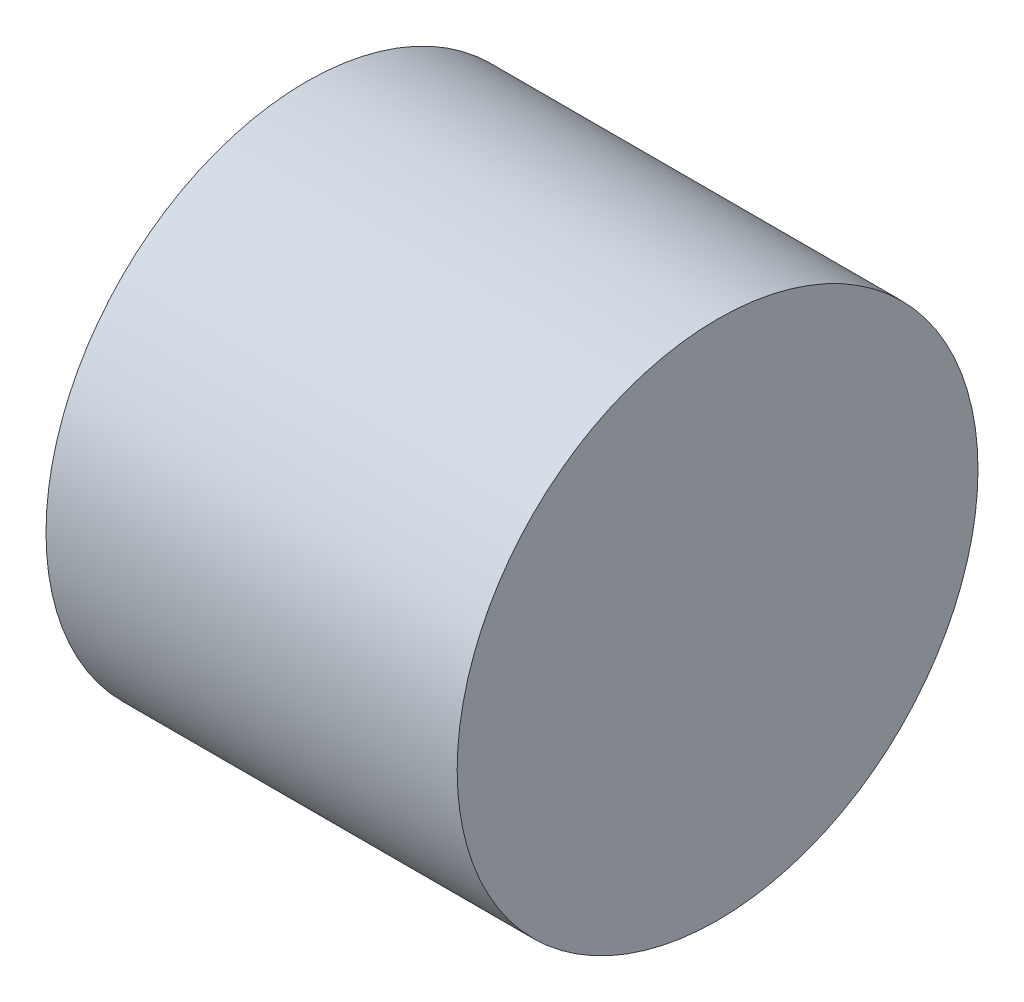
ISO-10303-21;
HEADER;
FILE_DESCRIPTION(('STEP AP214'),'2;1');
FILE_NAME('part.step','',(''),(''),'','','');
FILE_SCHEMA(('AUTOMOTIVE_DESIGN { 1 0 10303 214 1 1 1 1 }'));
ENDSEC;
DATA;
#1=APPLICATION_CONTEXT('core data for automotive mechanical design processes');
#2=APPLICATION_PROTOCOL_DEFINITION('international standard','automotive_design',2000,#1);
#3=PRODUCT_CONTEXT('',#1,'mechanical');
#4=PRODUCT('Part','Part','',(#3));
#5=PRODUCT_RELATED_PRODUCT_CATEGORY('part','',(#4));
#6=PRODUCT_DEFINITION_FORMATION('','',#4);
#7=PRODUCT_DEFINITION_CONTEXT('part definition',#1,'design');
#8=PRODUCT_DEFINITION('design','',#6,#7);
#9=PRODUCT_DEFINITION_SHAPE('','',#8);
#10=(LENGTH_UNIT() NAMED_UNIT(*) SI_UNIT(.MILLI.,.METRE.));
#11=(NAMED_UNIT(*) PLANE_ANGLE_UNIT() SI_UNIT($,.RADIAN.));
#12=(NAMED_UNIT(*) SI_UNIT($,.STERADIAN.) SOLID_ANGLE_UNIT());
#13=UNCERTAINTY_MEASURE_WITH_UNIT(LENGTH_MEASURE(1.E-05),#10,'distance_accuracy_value','');
#14=(GEOMETRIC_REPRESENTATION_CONTEXT(3) GLOBAL_UNCERTAINTY_ASSIGNED_CONTEXT((#13)) GLOBAL_UNIT_ASSIGNED_CONTEXT((#10,
#11,#12)) REPRESENTATION_CONTEXT('',''));
#15=CARTESIAN_POINT('',(0.,0.,0.));
#16=DIRECTION('',(0.,0.,1.));
#17=DIRECTION('',(1.,0.,0.));
#18=AXIS2_PLACEMENT_3D('',#15,#16,#17);
#19=CARTESIAN_POINT('',(15.,0.,0.));
#20=DIRECTION('',(-1.,0.,0.));
#21=DIRECTION('',(0.,0.,1.));
#22=AXIS2_PLACEMENT_3D('',#19,#20,#21);
#23=CYLINDRICAL_SURFACE('',#22,5.15);
#24=CARTESIAN_POINT('',(0.,0.,0.));
#25=DIRECTION('',(1.,0.,0.));
#26=DIRECTION('',(0.,0.,-1.));
#27=AXIS2_PLACEMENT_3D('',#24,#25,#26);
#28=CIRCLE('',#27,5.15);
#29=CARTESIAN_POINT('',(0.,0.,-5.15));
#30=VERTEX_POINT('',#29);
#31=EDGE_CURVE('E45',#30,#30,#28,.T.);
#32=ORIENTED_EDGE('',*,*,#31,.F.);
#33=EDGE_LOOP('',(#32));
#34=FACE_BOUND('',#33,.T.);
#35=CARTESIAN_POINT('',(13.,0.,0.));
#36=DIRECTION('',(1.,0.,0.));
#37=DIRECTION('',(0.,0.,-1.));
#38=AXIS2_PLACEMENT_3D('',#35,#36,#37);
#39=CIRCLE('',#38,5.15);
#40=CARTESIAN_POINT('',(13.,0.,-5.15));
#41=VERTEX_POINT('',#40);
#42=EDGE_CURVE('E49',#41,#41,#39,.T.);
#43=ORIENTED_EDGE('',*,*,#42,.T.);
#44=EDGE_LOOP('',(#43));
#45=FACE_BOUND('',#44,.T.);
#46=ADVANCED_FACE('F34',(#34,#45),#23,.F.);
#47=CARTESIAN_POINT('',(15.,0.,0.));
#48=DIRECTION('',(1.,0.,0.));
#49=DIRECTION('',(0.,0.,-1.));
#50=AXIS2_PLACEMENT_3D('',#47,#48,#49);
#51=PLANE('',#50);
#52=CARTESIAN_POINT('',(15.,0.,0.));
#53=DIRECTION('',(1.,0.,0.));
#54=DIRECTION('',(0.,0.,-1.));
#55=AXIS2_PLACEMENT_3D('',#52,#53,#54);
#56=CIRCLE('',#55,9.5);
#57=CARTESIAN_POINT('',(15.,0.,-9.5));
#58=VERTEX_POINT('',#57);
#59=EDGE_CURVE('E10',#58,#58,#56,.T.);
#60=ORIENTED_EDGE('',*,*,#59,.T.);
#61=EDGE_LOOP('',(#60));
#62=FACE_BOUND('',#61,.T.);
#63=ADVANCED_FACE('F64',(#62),#51,.T.);
#64=CARTESIAN_POINT('',(0.,0.,0.));
#65=DIRECTION('',(1.,0.,0.));
#66=DIRECTION('',(0.,0.,-1.));
#67=AXIS2_PLACEMENT_3D('',#64,#65,#66);
#68=PLANE('',#67);
#69=CARTESIAN_POINT('',(0.,0.,0.));
#70=DIRECTION('',(1.,0.,0.));
#71=DIRECTION('',(0.,0.,-1.));
#72=AXIS2_PLACEMENT_3D('',#69,#70,#71);
#73=CIRCLE('',#72,9.5);
#74=CARTESIAN_POINT('',(0.,0.,-9.5));
#75=VERTEX_POINT('',#74);
#76=EDGE_CURVE('E38',#75,#75,#73,.T.);
#77=ORIENTED_EDGE('',*,*,#76,.F.);
#78=EDGE_LOOP('',(#77));
#79=FACE_BOUND('',#78,.T.);
#80=ORIENTED_EDGE('',*,*,#31,.T.);
#81=EDGE_LOOP('',(#80));
#82=FACE_BOUND('',#81,.T.);
#83=ADVANCED_FACE('F60',(#79,#82),#68,.F.);
#84=CARTESIAN_POINT('',(15.,0.,0.));
#85=DIRECTION('',(-1.,0.,0.));
#86=DIRECTION('',(0.,0.,1.));
#87=AXIS2_PLACEMENT_3D('',#84,#85,#86);
#88=CYLINDRICAL_SURFACE('',#87,9.5);
#89=ORIENTED_EDGE('',*,*,#59,.F.);
#90=EDGE_LOOP('',(#89));
#91=FACE_BOUND('',#90,.T.);
#92=ORIENTED_EDGE('',*,*,#76,.T.);
#93=EDGE_LOOP('',(#92));
#94=FACE_BOUND('',#93,.T.);
#95=ADVANCED_FACE('F36',(#91,#94),#88,.T.);
#96=CARTESIAN_POINT('',(13.,0.,0.));
#97=DIRECTION('',(1.,0.,0.));
#98=DIRECTION('',(0.,0.,-1.));
#99=AXIS2_PLACEMENT_3D('',#96,#97,#98);
#100=PLANE('',#99);
#101=ORIENTED_EDGE('',*,*,#42,.F.);
#102=EDGE_LOOP('',(#101));
#103=FACE_BOUND('',#102,.T.);
#104=ADVANCED_FACE('F54',(#103),#100,.F.);
#105=CLOSED_SHELL('',(#46,#63,#83,#95,#104));
#106=MANIFOLD_SOLID_BREP('B2',#105);
#107=ADVANCED_BREP_SHAPE_REPRESENTATION('',(#18,#106),#14);
#108=SHAPE_DEFINITION_REPRESENTATION(#9,#107);
ENDSEC;
END-ISO-10303-21;
